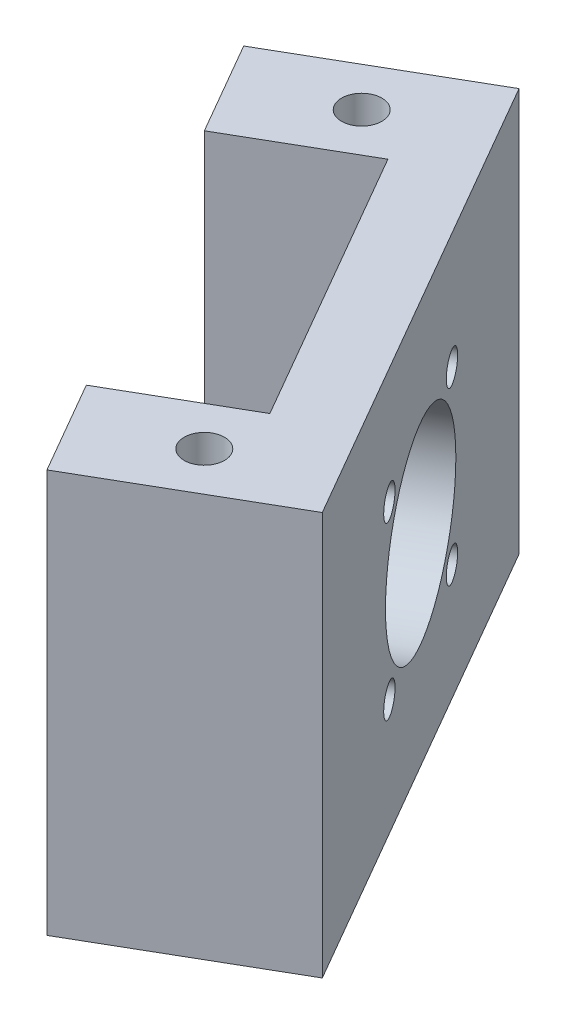
ISO-10303-21;
HEADER;
FILE_DESCRIPTION(('STEP AP214'),'2;1');
FILE_NAME('part.step','',(''),(''),'','','');
FILE_SCHEMA(('AUTOMOTIVE_DESIGN { 1 0 10303 214 1 1 1 1 }'));
ENDSEC;
DATA;
#1=APPLICATION_CONTEXT('core data for automotive mechanical design processes');
#2=APPLICATION_PROTOCOL_DEFINITION('international standard','automotive_design',2000,#1);
#3=PRODUCT_CONTEXT('',#1,'mechanical');
#4=PRODUCT('Part','Part','',(#3));
#5=PRODUCT_RELATED_PRODUCT_CATEGORY('part','',(#4));
#6=PRODUCT_DEFINITION_FORMATION('','',#4);
#7=PRODUCT_DEFINITION_CONTEXT('part definition',#1,'design');
#8=PRODUCT_DEFINITION('design','',#6,#7);
#9=PRODUCT_DEFINITION_SHAPE('','',#8);
#10=(LENGTH_UNIT() NAMED_UNIT(*) SI_UNIT(.MILLI.,.METRE.));
#11=(NAMED_UNIT(*) PLANE_ANGLE_UNIT() SI_UNIT($,.RADIAN.));
#12=(NAMED_UNIT(*) SI_UNIT($,.STERADIAN.) SOLID_ANGLE_UNIT());
#13=UNCERTAINTY_MEASURE_WITH_UNIT(LENGTH_MEASURE(1.E-05),#10,'distance_accuracy_value','');
#14=(GEOMETRIC_REPRESENTATION_CONTEXT(3) GLOBAL_UNCERTAINTY_ASSIGNED_CONTEXT((#13)) GLOBAL_UNIT_ASSIGNED_CONTEXT((#10,
#11,#12)) REPRESENTATION_CONTEXT('',''));
#15=CARTESIAN_POINT('',(0.,0.,0.));
#16=DIRECTION('',(0.,0.,1.));
#17=DIRECTION('',(1.,0.,0.));
#18=AXIS2_PLACEMENT_3D('',#15,#16,#17);
#19=CARTESIAN_POINT('',(0.,15.,0.));
#20=DIRECTION('',(0.,-1.,0.));
#21=DIRECTION('',(-0.866025403784443,0.,0.499999999999992));
#22=AXIS2_PLACEMENT_3D('',#19,#20,#21);
#23=PLANE('',#22);
#24=DIRECTION('',(0.866025403784443,0.,-0.499999999999992));
#25=VECTOR('',#24,1.);
#26=CARTESIAN_POINT('',(74.2957966166003,15.,-19.800687408666));
#27=LINE('',#26,#25);
#28=CARTESIAN_POINT('',(61.3054155598336,15.,-12.3006874086661));
#29=VERTEX_POINT('',#28);
#30=CARTESIAN_POINT('',(74.2957966166003,15.,-19.800687408666));
#31=VERTEX_POINT('',#30);
#32=EDGE_CURVE('E151',#29,#31,#27,.T.);
#33=ORIENTED_EDGE('',*,*,#32,.T.);
#34=DIRECTION('',(-0.499999999999992,0.,-0.866025403784443));
#35=VECTOR('',#34,1.);
#36=CARTESIAN_POINT('',(74.2957966166003,15.,-19.800687408666));
#37=LINE('',#36,#35);
#38=CARTESIAN_POINT('',(54.2957966166006,15.,-54.4417035600438));
#39=VERTEX_POINT('',#38);
#40=EDGE_CURVE('E99',#31,#39,#37,.T.);
#41=ORIENTED_EDGE('',*,*,#40,.T.);
#42=DIRECTION('',(-0.866025403784443,0.,0.499999999999992));
#43=VECTOR('',#42,1.);
#44=CARTESIAN_POINT('',(41.3054155598339,15.,-46.9417035600439));
#45=LINE('',#44,#43);
#46=CARTESIAN_POINT('',(41.3054155598339,15.,-46.9417035600439));
#47=VERTEX_POINT('',#46);
#48=EDGE_CURVE('E166',#39,#47,#45,.T.);
#49=ORIENTED_EDGE('',*,*,#48,.T.);
#50=DIRECTION('',(0.499999999999992,0.,0.866025403784443));
#51=VECTOR('',#50,1.);
#52=CARTESIAN_POINT('',(45.3054155598339,15.,-40.0135003297683));
#53=LINE('',#52,#51);
#54=CARTESIAN_POINT('',(45.3054155598339,15.,-40.0135003297683));
#55=VERTEX_POINT('',#54);
#56=EDGE_CURVE('E179',#47,#55,#53,.T.);
#57=ORIENTED_EDGE('',*,*,#56,.T.);
#58=DIRECTION('',(0.866025403784443,0.,-0.499999999999992));
#59=VECTOR('',#58,1.);
#60=CARTESIAN_POINT('',(53.9656695976783,15.,-45.0135003297682));
#61=LINE('',#60,#59);
#62=CARTESIAN_POINT('',(53.9656695976783,15.,-45.0135003297682));
#63=VERTEX_POINT('',#62);
#64=EDGE_CURVE('E118',#55,#63,#61,.T.);
#65=ORIENTED_EDGE('',*,*,#64,.T.);
#66=DIRECTION('',(0.499999999999992,0.,0.866025403784443));
#67=VECTOR('',#66,1.);
#68=CARTESIAN_POINT('',(65.9656695976781,15.,-24.2288906389416));
#69=LINE('',#68,#67);
#70=CARTESIAN_POINT('',(65.9656695976781,15.,-24.2288906389416));
#71=VERTEX_POINT('',#70);
#72=EDGE_CURVE('E112',#63,#71,#69,.T.);
#73=ORIENTED_EDGE('',*,*,#72,.T.);
#74=DIRECTION('',(-0.866025403784443,0.,0.499999999999992));
#75=VECTOR('',#74,1.);
#76=CARTESIAN_POINT('',(57.3054155598337,15.,-19.2288906389417));
#77=LINE('',#76,#75);
#78=CARTESIAN_POINT('',(57.3054155598337,15.,-19.2288906389417));
#79=VERTEX_POINT('',#78);
#80=EDGE_CURVE('E116',#71,#79,#77,.T.);
#81=ORIENTED_EDGE('',*,*,#80,.T.);
#82=DIRECTION('',(0.499999999999992,0.,0.866025403784443));
#83=VECTOR('',#82,1.);
#84=CARTESIAN_POINT('',(61.3054155598336,15.,-12.3006874086661));
#85=LINE('',#84,#83);
#86=EDGE_CURVE('E56',#79,#29,#85,.T.);
#87=ORIENTED_EDGE('',*,*,#86,.T.);
#88=EDGE_LOOP('',(#33,#41,#49,#57,#65,#73,#81,#87));
#89=FACE_BOUND('',#88,.T.);
#90=CARTESIAN_POINT('',(65.800606088217,15.,-19.5147890238039));
#91=DIRECTION('',(0.,1.,0.));
#92=DIRECTION('',(0.866025403784443,0.,-0.499999999999992));
#93=AXIS2_PLACEMENT_3D('',#90,#91,#92);
#94=CIRCLE('',#93,1.5);
#95=CARTESIAN_POINT('',(67.0996441938937,15.,-20.2647890238039));
#96=VERTEX_POINT('',#95);
#97=EDGE_CURVE('E140',#96,#96,#94,.T.);
#98=ORIENTED_EDGE('',*,*,#97,.F.);
#99=EDGE_LOOP('',(#98));
#100=FACE_BOUND('',#99,.T.);
#101=CARTESIAN_POINT('',(49.8006060882172,15.,-47.227601944906));
#102=DIRECTION('',(0.,1.,0.));
#103=DIRECTION('',(0.866025403784443,0.,-0.499999999999992));
#104=AXIS2_PLACEMENT_3D('',#101,#102,#103);
#105=CIRCLE('',#104,1.5);
#106=CARTESIAN_POINT('',(51.0996441938939,15.,-47.977601944906));
#107=VERTEX_POINT('',#106);
#108=EDGE_CURVE('E188',#107,#107,#105,.T.);
#109=ORIENTED_EDGE('',*,*,#108,.F.);
#110=EDGE_LOOP('',(#109));
#111=FACE_BOUND('',#110,.T.);
#112=ADVANCED_FACE('F39',(#89,#100,#111),#23,.F.);
#113=CARTESIAN_POINT('',(0.,-15.,0.));
#114=DIRECTION('',(0.,-1.,0.));
#115=DIRECTION('',(-0.866025403784443,0.,0.499999999999992));
#116=AXIS2_PLACEMENT_3D('',#113,#114,#115);
#117=PLANE('',#116);
#118=CARTESIAN_POINT('',(65.800606088217,-15.,-19.5147890238039));
#119=DIRECTION('',(0.,1.,0.));
#120=DIRECTION('',(0.866025403784443,0.,-0.499999999999992));
#121=AXIS2_PLACEMENT_3D('',#118,#119,#120);
#122=CIRCLE('',#121,1.5);
#123=CARTESIAN_POINT('',(67.0996441938937,-15.,-20.2647890238039));
#124=VERTEX_POINT('',#123);
#125=EDGE_CURVE('E185',#124,#124,#122,.T.);
#126=ORIENTED_EDGE('',*,*,#125,.T.);
#127=EDGE_LOOP('',(#126));
#128=FACE_BOUND('',#127,.T.);
#129=DIRECTION('',(0.866025403784443,0.,-0.499999999999992));
#130=VECTOR('',#129,1.);
#131=CARTESIAN_POINT('',(74.2957966166003,-15.,-19.800687408666));
#132=LINE('',#131,#130);
#133=CARTESIAN_POINT('',(61.3054155598336,-15.,-12.3006874086661));
#134=VERTEX_POINT('',#133);
#135=CARTESIAN_POINT('',(74.2957966166003,-15.,-19.800687408666));
#136=VERTEX_POINT('',#135);
#137=EDGE_CURVE('E136',#134,#136,#132,.T.);
#138=ORIENTED_EDGE('',*,*,#137,.F.);
#139=DIRECTION('',(0.499999999999992,0.,0.866025403784443));
#140=VECTOR('',#139,1.);
#141=CARTESIAN_POINT('',(61.3054155598336,-15.,-12.3006874086661));
#142=LINE('',#141,#140);
#143=CARTESIAN_POINT('',(57.3054155598337,-15.,-19.2288906389417));
#144=VERTEX_POINT('',#143);
#145=EDGE_CURVE('E91',#144,#134,#142,.T.);
#146=ORIENTED_EDGE('',*,*,#145,.F.);
#147=DIRECTION('',(-0.866025403784443,0.,0.499999999999992));
#148=VECTOR('',#147,1.);
#149=CARTESIAN_POINT('',(57.3054155598337,-15.,-19.2288906389417));
#150=LINE('',#149,#148);
#151=CARTESIAN_POINT('',(65.9656695976781,-15.,-24.2288906389416));
#152=VERTEX_POINT('',#151);
#153=EDGE_CURVE('E85',#152,#144,#150,.T.);
#154=ORIENTED_EDGE('',*,*,#153,.F.);
#155=DIRECTION('',(0.499999999999992,0.,0.866025403784443));
#156=VECTOR('',#155,1.);
#157=CARTESIAN_POINT('',(65.9656695976781,-15.,-24.2288906389416));
#158=LINE('',#157,#156);
#159=CARTESIAN_POINT('',(53.9656695976783,-15.,-45.0135003297682));
#160=VERTEX_POINT('',#159);
#161=EDGE_CURVE('E126',#160,#152,#158,.T.);
#162=ORIENTED_EDGE('',*,*,#161,.F.);
#163=DIRECTION('',(0.866025403784443,0.,-0.499999999999992));
#164=VECTOR('',#163,1.);
#165=CARTESIAN_POINT('',(53.9656695976783,-15.,-45.0135003297682));
#166=LINE('',#165,#164);
#167=CARTESIAN_POINT('',(45.3054155598339,-15.,-40.0135003297683));
#168=VERTEX_POINT('',#167);
#169=EDGE_CURVE('E146',#168,#160,#166,.T.);
#170=ORIENTED_EDGE('',*,*,#169,.F.);
#171=DIRECTION('',(0.499999999999992,0.,0.866025403784443));
#172=VECTOR('',#171,1.);
#173=CARTESIAN_POINT('',(45.3054155598339,-15.,-40.0135003297683));
#174=LINE('',#173,#172);
#175=CARTESIAN_POINT('',(41.3054155598339,-15.,-46.9417035600439));
#176=VERTEX_POINT('',#175);
#177=EDGE_CURVE('E144',#176,#168,#174,.T.);
#178=ORIENTED_EDGE('',*,*,#177,.F.);
#179=DIRECTION('',(-0.866025403784443,0.,0.499999999999992));
#180=VECTOR('',#179,1.);
#181=CARTESIAN_POINT('',(41.3054155598339,-15.,-46.9417035600439));
#182=LINE('',#181,#180);
#183=CARTESIAN_POINT('',(54.2957966166006,-15.,-54.4417035600438));
#184=VERTEX_POINT('',#183);
#185=EDGE_CURVE('E142',#184,#176,#182,.T.);
#186=ORIENTED_EDGE('',*,*,#185,.F.);
#187=DIRECTION('',(-0.499999999999992,0.,-0.866025403784443));
#188=VECTOR('',#187,1.);
#189=CARTESIAN_POINT('',(74.2957966166003,-15.,-19.800687408666));
#190=LINE('',#189,#188);
#191=EDGE_CURVE('E139',#136,#184,#190,.T.);
#192=ORIENTED_EDGE('',*,*,#191,.F.);
#193=EDGE_LOOP('',(#138,#146,#154,#162,#170,#178,#186,#192));
#194=FACE_BOUND('',#193,.T.);
#195=CARTESIAN_POINT('',(49.8006060882172,-15.,-47.227601944906));
#196=DIRECTION('',(0.,1.,0.));
#197=DIRECTION('',(0.866025403784443,0.,-0.499999999999992));
#198=AXIS2_PLACEMENT_3D('',#195,#196,#197);
#199=CIRCLE('',#198,1.5);
#200=CARTESIAN_POINT('',(51.0996441938939,-15.,-47.977601944906));
#201=VERTEX_POINT('',#200);
#202=EDGE_CURVE('E191',#201,#201,#199,.T.);
#203=ORIENTED_EDGE('',*,*,#202,.T.);
#204=EDGE_LOOP('',(#203));
#205=FACE_BOUND('',#204,.T.);
#206=ADVANCED_FACE('F170',(#128,#194,#205),#117,.T.);
#207=CARTESIAN_POINT('',(74.2957966166003,15.,-19.800687408666));
#208=DIRECTION('',(-0.499999999999992,0.,-0.866025403784443));
#209=DIRECTION('',(-0.866025403784443,0.,0.499999999999992));
#210=AXIS2_PLACEMENT_3D('',#207,#208,#209);
#211=PLANE('',#210);
#212=ORIENTED_EDGE('',*,*,#137,.T.);
#213=DIRECTION('',(0.,-1.,0.));
#214=VECTOR('',#213,1.);
#215=CARTESIAN_POINT('',(74.2957966166003,15.,-19.800687408666));
#216=LINE('',#215,#214);
#217=EDGE_CURVE('E11',#31,#136,#216,.T.);
#218=ORIENTED_EDGE('',*,*,#217,.F.);
#219=ORIENTED_EDGE('',*,*,#32,.F.);
#220=DIRECTION('',(0.,-1.,0.));
#221=VECTOR('',#220,1.);
#222=CARTESIAN_POINT('',(61.3054155598336,15.,-12.3006874086661));
#223=LINE('',#222,#221);
#224=EDGE_CURVE('E132',#29,#134,#223,.T.);
#225=ORIENTED_EDGE('',*,*,#224,.T.);
#226=EDGE_LOOP('',(#212,#218,#219,#225));
#227=FACE_BOUND('',#226,.T.);
#228=ADVANCED_FACE('F41',(#227),#211,.F.);
#229=CARTESIAN_POINT('',(74.2957966166003,15.,-19.800687408666));
#230=DIRECTION('',(-0.866025403784443,0.,0.499999999999992));
#231=DIRECTION('',(0.499999999999992,0.,0.866025403784443));
#232=AXIS2_PLACEMENT_3D('',#229,#230,#231);
#233=PLANE('',#232);
#234=CARTESIAN_POINT('',(67.4777771319398,6.36396103067896,-31.6098435630928));
#235=DIRECTION('',(0.866025403784443,0.,-0.499999999999992));
#236=DIRECTION('',(-0.499999999999992,0.,-0.866025403784443));
#237=AXIS2_PLACEMENT_3D('',#234,#235,#236);
#238=CIRCLE('',#237,1.15);
#239=CARTESIAN_POINT('',(66.9027771319398,6.36396103067896,-32.6057727774449));
#240=VERTEX_POINT('',#239);
#241=EDGE_CURVE('E203',#240,#240,#238,.T.);
#242=ORIENTED_EDGE('',*,*,#241,.F.);
#243=EDGE_LOOP('',(#242));
#244=FACE_BOUND('',#243,.T.);
#245=CARTESIAN_POINT('',(67.4777771319398,-6.36396103067888,-31.6098435630927));
#246=DIRECTION('',(0.866025403784443,0.,-0.499999999999992));
#247=DIRECTION('',(-0.499999999999992,0.,-0.866025403784443));
#248=AXIS2_PLACEMENT_3D('',#245,#246,#247);
#249=CIRCLE('',#248,1.15);
#250=CARTESIAN_POINT('',(66.9027771319399,-6.36396103067888,-32.6057727774448));
#251=VERTEX_POINT('',#250);
#252=EDGE_CURVE('E210',#251,#251,#249,.T.);
#253=ORIENTED_EDGE('',*,*,#252,.F.);
#254=EDGE_LOOP('',(#253));
#255=FACE_BOUND('',#254,.T.);
#256=CARTESIAN_POINT('',(61.113816101261,-6.36396103067896,-42.632547405617));
#257=DIRECTION('',(0.866025403784443,0.,-0.499999999999992));
#258=DIRECTION('',(-0.499999999999992,0.,-0.866025403784443));
#259=AXIS2_PLACEMENT_3D('',#256,#257,#258);
#260=CIRCLE('',#259,1.15);
#261=CARTESIAN_POINT('',(60.538816101261,-6.36396103067896,-43.6284766199691));
#262=VERTEX_POINT('',#261);
#263=EDGE_CURVE('E216',#262,#262,#260,.T.);
#264=ORIENTED_EDGE('',*,*,#263,.F.);
#265=EDGE_LOOP('',(#264));
#266=FACE_BOUND('',#265,.T.);
#267=CARTESIAN_POINT('',(61.113816101261,6.36396103067888,-42.6325474056171));
#268=DIRECTION('',(0.866025403784443,0.,-0.499999999999992));
#269=DIRECTION('',(-0.499999999999992,0.,-0.866025403784443));
#270=AXIS2_PLACEMENT_3D('',#267,#268,#269);
#271=CIRCLE('',#270,1.15);
#272=CARTESIAN_POINT('',(60.538816101261,6.36396103067888,-43.6284766199692));
#273=VERTEX_POINT('',#272);
#274=EDGE_CURVE('E202',#273,#273,#271,.T.);
#275=ORIENTED_EDGE('',*,*,#274,.F.);
#276=EDGE_LOOP('',(#275));
#277=FACE_BOUND('',#276,.T.);
#278=CARTESIAN_POINT('',(64.2957966166004,0.,-37.1211954843549));
#279=DIRECTION('',(0.866025403784443,0.,-0.499999999999992));
#280=DIRECTION('',(-0.499999999999992,0.,-0.866025403784443));
#281=AXIS2_PLACEMENT_3D('',#278,#279,#280);
#282=CIRCLE('',#281,7.15);
#283=CARTESIAN_POINT('',(60.7207966166005,0.,-43.3132771214137));
#284=VERTEX_POINT('',#283);
#285=EDGE_CURVE('E199',#284,#284,#282,.T.);
#286=ORIENTED_EDGE('',*,*,#285,.F.);
#287=EDGE_LOOP('',(#286));
#288=FACE_BOUND('',#287,.T.);
#289=ORIENTED_EDGE('',*,*,#191,.T.);
#290=DIRECTION('',(0.,-1.,0.));
#291=VECTOR('',#290,1.);
#292=CARTESIAN_POINT('',(54.2957966166006,15.,-54.4417035600438));
#293=LINE('',#292,#291);
#294=EDGE_CURVE('E48',#39,#184,#293,.T.);
#295=ORIENTED_EDGE('',*,*,#294,.F.);
#296=ORIENTED_EDGE('',*,*,#40,.F.);
#297=ORIENTED_EDGE('',*,*,#217,.T.);
#298=EDGE_LOOP('',(#289,#295,#296,#297));
#299=FACE_BOUND('',#298,.T.);
#300=ADVANCED_FACE('F270',(#244,#255,#266,#277,#288,#299),#233,.F.);
#301=CARTESIAN_POINT('',(41.3054155598339,15.,-46.9417035600439));
#302=DIRECTION('',(0.499999999999992,0.,0.866025403784443));
#303=DIRECTION('',(0.866025403784443,0.,-0.499999999999992));
#304=AXIS2_PLACEMENT_3D('',#301,#302,#303);
#305=PLANE('',#304);
#306=ORIENTED_EDGE('',*,*,#185,.T.);
#307=DIRECTION('',(0.,-1.,0.));
#308=VECTOR('',#307,1.);
#309=CARTESIAN_POINT('',(41.3054155598339,15.,-46.9417035600439));
#310=LINE('',#309,#308);
#311=EDGE_CURVE('E158',#47,#176,#310,.T.);
#312=ORIENTED_EDGE('',*,*,#311,.F.);
#313=ORIENTED_EDGE('',*,*,#48,.F.);
#314=ORIENTED_EDGE('',*,*,#294,.T.);
#315=EDGE_LOOP('',(#306,#312,#313,#314));
#316=FACE_BOUND('',#315,.T.);
#317=ADVANCED_FACE('F164',(#316),#305,.F.);
#318=CARTESIAN_POINT('',(45.3054155598339,15.,-40.0135003297683));
#319=DIRECTION('',(0.866025403784443,0.,-0.499999999999992));
#320=DIRECTION('',(-0.499999999999992,0.,-0.866025403784443));
#321=AXIS2_PLACEMENT_3D('',#318,#319,#320);
#322=PLANE('',#321);
#323=ORIENTED_EDGE('',*,*,#177,.T.);
#324=DIRECTION('',(0.,-1.,0.));
#325=VECTOR('',#324,1.);
#326=CARTESIAN_POINT('',(45.3054155598339,15.,-40.0135003297683));
#327=LINE('',#326,#325);
#328=EDGE_CURVE('E155',#55,#168,#327,.T.);
#329=ORIENTED_EDGE('',*,*,#328,.F.);
#330=ORIENTED_EDGE('',*,*,#56,.F.);
#331=ORIENTED_EDGE('',*,*,#311,.T.);
#332=EDGE_LOOP('',(#323,#329,#330,#331));
#333=FACE_BOUND('',#332,.T.);
#334=ADVANCED_FACE('F175',(#333),#322,.F.);
#335=CARTESIAN_POINT('',(53.9656695976783,15.,-45.0135003297682));
#336=DIRECTION('',(-0.499999999999992,0.,-0.866025403784443));
#337=DIRECTION('',(-0.866025403784443,0.,0.499999999999992));
#338=AXIS2_PLACEMENT_3D('',#335,#336,#337);
#339=PLANE('',#338);
#340=ORIENTED_EDGE('',*,*,#169,.T.);
#341=DIRECTION('',(0.,-1.,0.));
#342=VECTOR('',#341,1.);
#343=CARTESIAN_POINT('',(53.9656695976783,15.,-45.0135003297682));
#344=LINE('',#343,#342);
#345=EDGE_CURVE('E127',#63,#160,#344,.T.);
#346=ORIENTED_EDGE('',*,*,#345,.F.);
#347=ORIENTED_EDGE('',*,*,#64,.F.);
#348=ORIENTED_EDGE('',*,*,#328,.T.);
#349=EDGE_LOOP('',(#340,#346,#347,#348));
#350=FACE_BOUND('',#349,.T.);
#351=ADVANCED_FACE('F178',(#350),#339,.F.);
#352=CARTESIAN_POINT('',(65.9656695976781,15.,-24.2288906389416));
#353=DIRECTION('',(0.866025403784443,0.,-0.499999999999992));
#354=DIRECTION('',(-0.499999999999992,0.,-0.866025403784443));
#355=AXIS2_PLACEMENT_3D('',#352,#353,#354);
#356=PLANE('',#355);
#357=CARTESIAN_POINT('',(63.1476501130176,6.36396103067896,-29.1098435630928));
#358=DIRECTION('',(0.866025403784443,0.,-0.499999999999992));
#359=DIRECTION('',(-0.499999999999992,0.,-0.866025403784443));
#360=AXIS2_PLACEMENT_3D('',#357,#358,#359);
#361=CIRCLE('',#360,1.15);
#362=CARTESIAN_POINT('',(62.5726501130176,6.36396103067896,-30.1057727774449));
#363=VERTEX_POINT('',#362);
#364=EDGE_CURVE('E207',#363,#363,#361,.F.);
#365=ORIENTED_EDGE('',*,*,#364,.F.);
#366=EDGE_LOOP('',(#365));
#367=FACE_BOUND('',#366,.T.);
#368=CARTESIAN_POINT('',(63.1476501130176,-6.36396103067888,-29.1098435630927));
#369=DIRECTION('',(0.866025403784443,0.,-0.499999999999992));
#370=DIRECTION('',(-0.499999999999992,0.,-0.866025403784443));
#371=AXIS2_PLACEMENT_3D('',#368,#369,#370);
#372=CIRCLE('',#371,1.15);
#373=CARTESIAN_POINT('',(62.5726501130176,-6.36396103067888,-30.1057727774448));
#374=VERTEX_POINT('',#373);
#375=EDGE_CURVE('E206',#374,#374,#372,.F.);
#376=ORIENTED_EDGE('',*,*,#375,.F.);
#377=EDGE_LOOP('',(#376));
#378=FACE_BOUND('',#377,.T.);
#379=CARTESIAN_POINT('',(56.7836890823388,-6.36396103067896,-40.1325474056171));
#380=DIRECTION('',(0.866025403784443,0.,-0.499999999999992));
#381=DIRECTION('',(-0.499999999999992,0.,-0.866025403784443));
#382=AXIS2_PLACEMENT_3D('',#379,#380,#381);
#383=CIRCLE('',#382,1.15);
#384=CARTESIAN_POINT('',(56.2086890823388,-6.36396103067896,-41.1284766199692));
#385=VERTEX_POINT('',#384);
#386=EDGE_CURVE('E213',#385,#385,#383,.F.);
#387=ORIENTED_EDGE('',*,*,#386,.F.);
#388=EDGE_LOOP('',(#387));
#389=FACE_BOUND('',#388,.T.);
#390=CARTESIAN_POINT('',(56.7836890823388,6.36396103067888,-40.1325474056171));
#391=DIRECTION('',(0.866025403784443,0.,-0.499999999999992));
#392=DIRECTION('',(-0.499999999999992,0.,-0.866025403784443));
#393=AXIS2_PLACEMENT_3D('',#390,#391,#392);
#394=CIRCLE('',#393,1.15);
#395=CARTESIAN_POINT('',(56.2086890823388,6.36396103067888,-41.1284766199693));
#396=VERTEX_POINT('',#395);
#397=EDGE_CURVE('E219',#396,#396,#394,.F.);
#398=ORIENTED_EDGE('',*,*,#397,.F.);
#399=EDGE_LOOP('',(#398));
#400=FACE_BOUND('',#399,.T.);
#401=CARTESIAN_POINT('',(59.9656695976782,0.,-34.6211954843549));
#402=DIRECTION('',(0.866025403784443,0.,-0.499999999999992));
#403=DIRECTION('',(-0.499999999999992,0.,-0.866025403784443));
#404=AXIS2_PLACEMENT_3D('',#401,#402,#403);
#405=CIRCLE('',#404,7.15);
#406=CARTESIAN_POINT('',(56.3906695976783,0.,-40.8132771214137));
#407=VERTEX_POINT('',#406);
#408=EDGE_CURVE('E194',#407,#407,#405,.F.);
#409=ORIENTED_EDGE('',*,*,#408,.F.);
#410=EDGE_LOOP('',(#409));
#411=FACE_BOUND('',#410,.T.);
#412=ORIENTED_EDGE('',*,*,#161,.T.);
#413=DIRECTION('',(0.,-1.,0.));
#414=VECTOR('',#413,1.);
#415=CARTESIAN_POINT('',(65.9656695976781,15.,-24.2288906389416));
#416=LINE('',#415,#414);
#417=EDGE_CURVE('E123',#71,#152,#416,.T.);
#418=ORIENTED_EDGE('',*,*,#417,.F.);
#419=ORIENTED_EDGE('',*,*,#72,.F.);
#420=ORIENTED_EDGE('',*,*,#345,.T.);
#421=EDGE_LOOP('',(#412,#418,#419,#420));
#422=FACE_BOUND('',#421,.T.);
#423=ADVANCED_FACE('F124',(#367,#378,#389,#400,#411,#422),#356,.F.);
#424=CARTESIAN_POINT('',(57.3054155598337,15.,-19.2288906389417));
#425=DIRECTION('',(0.499999999999992,0.,0.866025403784443));
#426=DIRECTION('',(0.866025403784443,0.,-0.499999999999992));
#427=AXIS2_PLACEMENT_3D('',#424,#425,#426);
#428=PLANE('',#427);
#429=ORIENTED_EDGE('',*,*,#153,.T.);
#430=DIRECTION('',(0.,-1.,0.));
#431=VECTOR('',#430,1.);
#432=CARTESIAN_POINT('',(57.3054155598337,15.,-19.2288906389417));
#433=LINE('',#432,#431);
#434=EDGE_CURVE('E128',#79,#144,#433,.T.);
#435=ORIENTED_EDGE('',*,*,#434,.F.);
#436=ORIENTED_EDGE('',*,*,#80,.F.);
#437=ORIENTED_EDGE('',*,*,#417,.T.);
#438=EDGE_LOOP('',(#429,#435,#436,#437));
#439=FACE_BOUND('',#438,.T.);
#440=ADVANCED_FACE('F130',(#439),#428,.F.);
#441=CARTESIAN_POINT('',(61.3054155598336,15.,-12.3006874086661));
#442=DIRECTION('',(0.866025403784443,0.,-0.499999999999992));
#443=DIRECTION('',(-0.499999999999992,0.,-0.866025403784443));
#444=AXIS2_PLACEMENT_3D('',#441,#442,#443);
#445=PLANE('',#444);
#446=ORIENTED_EDGE('',*,*,#145,.T.);
#447=ORIENTED_EDGE('',*,*,#224,.F.);
#448=ORIENTED_EDGE('',*,*,#86,.F.);
#449=ORIENTED_EDGE('',*,*,#434,.T.);
#450=EDGE_LOOP('',(#446,#447,#448,#449));
#451=FACE_BOUND('',#450,.T.);
#452=ADVANCED_FACE('F260',(#451),#445,.F.);
#453=CARTESIAN_POINT('',(65.800606088217,15.,-19.5147890238039));
#454=DIRECTION('',(0.,-1.,0.));
#455=DIRECTION('',(-0.866025403784443,0.,0.499999999999992));
#456=AXIS2_PLACEMENT_3D('',#453,#454,#455);
#457=CYLINDRICAL_SURFACE('',#456,1.5);
#458=ORIENTED_EDGE('',*,*,#97,.T.);
#459=EDGE_LOOP('',(#458));
#460=FACE_BOUND('',#459,.T.);
#461=ORIENTED_EDGE('',*,*,#125,.F.);
#462=EDGE_LOOP('',(#461));
#463=FACE_BOUND('',#462,.T.);
#464=ADVANCED_FACE('F247',(#460,#463),#457,.F.);
#465=CARTESIAN_POINT('',(49.8006060882172,15.,-47.227601944906));
#466=DIRECTION('',(0.,-1.,0.));
#467=DIRECTION('',(-0.866025403784443,0.,0.499999999999992));
#468=AXIS2_PLACEMENT_3D('',#465,#466,#467);
#469=CYLINDRICAL_SURFACE('',#468,1.5);
#470=ORIENTED_EDGE('',*,*,#108,.T.);
#471=EDGE_LOOP('',(#470));
#472=FACE_BOUND('',#471,.T.);
#473=ORIENTED_EDGE('',*,*,#202,.F.);
#474=EDGE_LOOP('',(#473));
#475=FACE_BOUND('',#474,.T.);
#476=ADVANCED_FACE('F237',(#472,#475),#469,.F.);
#477=CARTESIAN_POINT('',(-90.9335334227703,0.,52.5004999999991));
#478=DIRECTION('',(0.866025403784443,0.,-0.499999999999992));
#479=DIRECTION('',(-0.499999999999992,0.,-0.866025403784443));
#480=AXIS2_PLACEMENT_3D('',#477,#478,#479);
#481=CYLINDRICAL_SURFACE('',#480,7.15);
#482=ORIENTED_EDGE('',*,*,#285,.T.);
#483=EDGE_LOOP('',(#482));
#484=FACE_BOUND('',#483,.T.);
#485=ORIENTED_EDGE('',*,*,#408,.T.);
#486=EDGE_LOOP('',(#485));
#487=FACE_BOUND('',#486,.T.);
#488=ADVANCED_FACE('F235',(#484,#487),#481,.F.);
#489=CARTESIAN_POINT('',(-94.1155139381098,6.36396103067888,46.9891480787369));
#490=DIRECTION('',(0.866025403784443,0.,-0.499999999999992));
#491=DIRECTION('',(-0.499999999999992,0.,-0.866025403784443));
#492=AXIS2_PLACEMENT_3D('',#489,#490,#491);
#493=CYLINDRICAL_SURFACE('',#492,1.15);
#494=ORIENTED_EDGE('',*,*,#274,.T.);
#495=EDGE_LOOP('',(#494));
#496=FACE_BOUND('',#495,.T.);
#497=ORIENTED_EDGE('',*,*,#397,.T.);
#498=EDGE_LOOP('',(#497));
#499=FACE_BOUND('',#498,.T.);
#500=ADVANCED_FACE('F227',(#496,#499),#493,.F.);
#501=CARTESIAN_POINT('',(-94.1155139381097,-6.36396103067896,46.989148078737));
#502=DIRECTION('',(0.866025403784443,0.,-0.499999999999992));
#503=DIRECTION('',(-0.499999999999992,0.,-0.866025403784443));
#504=AXIS2_PLACEMENT_3D('',#501,#502,#503);
#505=CYLINDRICAL_SURFACE('',#504,1.15);
#506=ORIENTED_EDGE('',*,*,#263,.T.);
#507=EDGE_LOOP('',(#506));
#508=FACE_BOUND('',#507,.T.);
#509=ORIENTED_EDGE('',*,*,#386,.T.);
#510=EDGE_LOOP('',(#509));
#511=FACE_BOUND('',#510,.T.);
#512=ADVANCED_FACE('F244',(#508,#511),#505,.F.);
#513=CARTESIAN_POINT('',(-87.7515529074309,-6.36396103067888,58.0118519212614));
#514=DIRECTION('',(0.866025403784443,0.,-0.499999999999992));
#515=DIRECTION('',(-0.499999999999992,0.,-0.866025403784443));
#516=AXIS2_PLACEMENT_3D('',#513,#514,#515);
#517=CYLINDRICAL_SURFACE('',#516,1.15);
#518=ORIENTED_EDGE('',*,*,#252,.T.);
#519=EDGE_LOOP('',(#518));
#520=FACE_BOUND('',#519,.T.);
#521=ORIENTED_EDGE('',*,*,#375,.T.);
#522=EDGE_LOOP('',(#521));
#523=FACE_BOUND('',#522,.T.);
#524=ADVANCED_FACE('F291',(#520,#523),#517,.F.);
#525=CARTESIAN_POINT('',(-87.7515529074309,6.36396103067896,58.0118519212613));
#526=DIRECTION('',(0.866025403784443,0.,-0.499999999999992));
#527=DIRECTION('',(-0.499999999999992,0.,-0.866025403784443));
#528=AXIS2_PLACEMENT_3D('',#525,#526,#527);
#529=CYLINDRICAL_SURFACE('',#528,1.15);
#530=ORIENTED_EDGE('',*,*,#241,.T.);
#531=EDGE_LOOP('',(#530));
#532=FACE_BOUND('',#531,.T.);
#533=ORIENTED_EDGE('',*,*,#364,.T.);
#534=EDGE_LOOP('',(#533));
#535=FACE_BOUND('',#534,.T.);
#536=ADVANCED_FACE('F298',(#532,#535),#529,.F.);
#537=CLOSED_SHELL('',(#112,#206,#228,#300,#317,#334,#351,#423,#440,#452,#464,#476,#488,#500,
#512,#524,#536));
#538=MANIFOLD_SOLID_BREP('B2',#537);
#539=ADVANCED_BREP_SHAPE_REPRESENTATION('',(#18,#538),#14);
#540=SHAPE_DEFINITION_REPRESENTATION(#9,#539);
ENDSEC;
END-ISO-10303-21;
